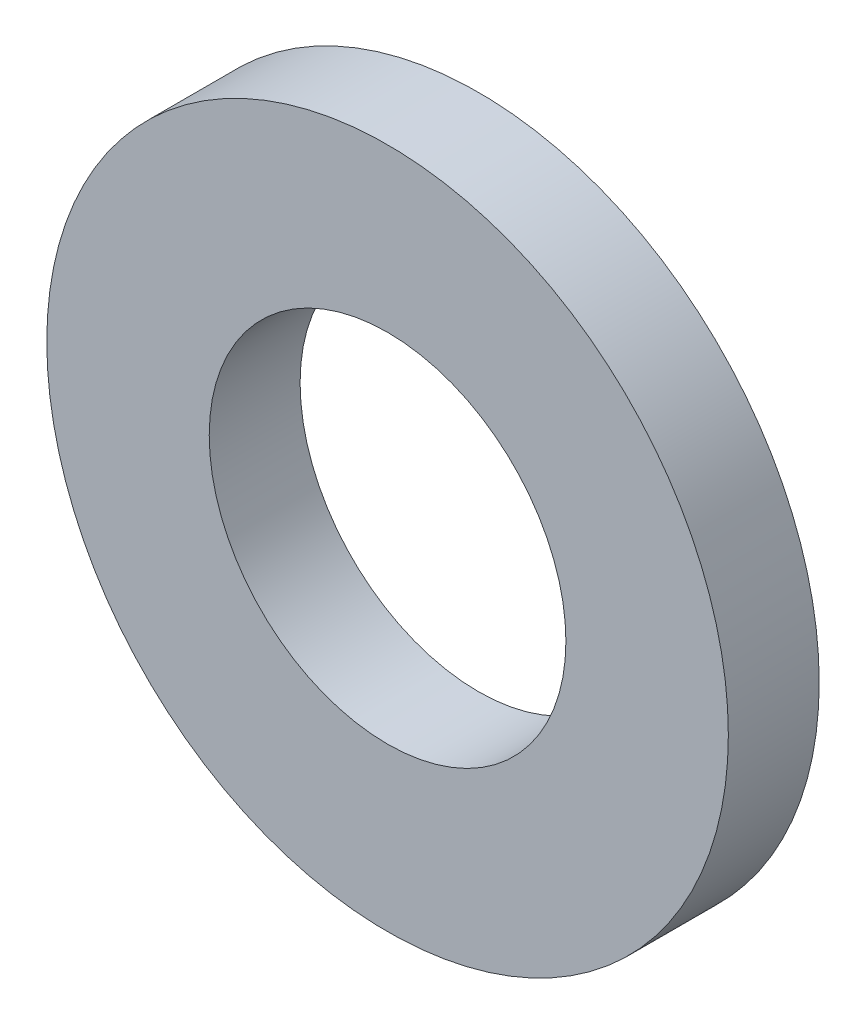
ISO-10303-21;
HEADER;
FILE_DESCRIPTION(('STEP AP214'),'2;1');
FILE_NAME('part.step','',(''),(''),'','','');
FILE_SCHEMA(('AUTOMOTIVE_DESIGN { 1 0 10303 214 1 1 1 1 }'));
ENDSEC;
DATA;
#1=APPLICATION_CONTEXT('core data for automotive mechanical design processes');
#2=APPLICATION_PROTOCOL_DEFINITION('international standard','automotive_design',2000,#1);
#3=PRODUCT_CONTEXT('',#1,'mechanical');
#4=PRODUCT('Part','Part','',(#3));
#5=PRODUCT_RELATED_PRODUCT_CATEGORY('part','',(#4));
#6=PRODUCT_DEFINITION_FORMATION('','',#4);
#7=PRODUCT_DEFINITION_CONTEXT('part definition',#1,'design');
#8=PRODUCT_DEFINITION('design','',#6,#7);
#9=PRODUCT_DEFINITION_SHAPE('','',#8);
#10=(LENGTH_UNIT() NAMED_UNIT(*) SI_UNIT(.MILLI.,.METRE.));
#11=(NAMED_UNIT(*) PLANE_ANGLE_UNIT() SI_UNIT($,.RADIAN.));
#12=(NAMED_UNIT(*) SI_UNIT($,.STERADIAN.) SOLID_ANGLE_UNIT());
#13=UNCERTAINTY_MEASURE_WITH_UNIT(LENGTH_MEASURE(1.E-05),#10,'distance_accuracy_value','');
#14=(GEOMETRIC_REPRESENTATION_CONTEXT(3) GLOBAL_UNCERTAINTY_ASSIGNED_CONTEXT((#13)) GLOBAL_UNIT_ASSIGNED_CONTEXT((#10,
#11,#12)) REPRESENTATION_CONTEXT('',''));
#15=CARTESIAN_POINT('',(0.,0.,0.));
#16=DIRECTION('',(0.,0.,1.));
#17=DIRECTION('',(1.,0.,0.));
#18=AXIS2_PLACEMENT_3D('',#15,#16,#17);
#19=CARTESIAN_POINT('',(0.,0.,-0.8));
#20=DIRECTION('',(0.,0.,1.));
#21=DIRECTION('',(1.,0.,0.));
#22=AXIS2_PLACEMENT_3D('',#19,#20,#21);
#23=CYLINDRICAL_SURFACE('',#22,3.);
#24=CARTESIAN_POINT('',(0.,0.,-0.8));
#25=DIRECTION('',(0.,0.,1.));
#26=DIRECTION('',(1.,0.,0.));
#27=AXIS2_PLACEMENT_3D('',#24,#25,#26);
#28=CIRCLE('',#27,3.);
#29=CARTESIAN_POINT('',(3.,0.,-0.8));
#30=VERTEX_POINT('',#29);
#31=EDGE_CURVE('E10',#30,#30,#28,.T.);
#32=ORIENTED_EDGE('',*,*,#31,.T.);
#33=EDGE_LOOP('',(#32));
#34=FACE_BOUND('',#33,.T.);
#35=CARTESIAN_POINT('',(0.,0.,0.));
#36=DIRECTION('',(0.,0.,1.));
#37=DIRECTION('',(1.,0.,0.));
#38=AXIS2_PLACEMENT_3D('',#35,#36,#37);
#39=CIRCLE('',#38,3.);
#40=CARTESIAN_POINT('',(3.,0.,0.));
#41=VERTEX_POINT('',#40);
#42=EDGE_CURVE('E33',#41,#41,#39,.T.);
#43=ORIENTED_EDGE('',*,*,#42,.F.);
#44=EDGE_LOOP('',(#43));
#45=FACE_BOUND('',#44,.T.);
#46=ADVANCED_FACE('F30',(#34,#45),#23,.T.);
#47=CARTESIAN_POINT('',(0.,0.,-0.8));
#48=DIRECTION('',(0.,0.,1.));
#49=DIRECTION('',(1.,0.,0.));
#50=AXIS2_PLACEMENT_3D('',#47,#48,#49);
#51=PLANE('',#50);
#52=CARTESIAN_POINT('',(0.,0.,-0.8));
#53=DIRECTION('',(0.,0.,1.));
#54=DIRECTION('',(1.,0.,0.));
#55=AXIS2_PLACEMENT_3D('',#52,#53,#54);
#56=CIRCLE('',#55,1.57);
#57=CARTESIAN_POINT('',(1.57,0.,-0.8));
#58=VERTEX_POINT('',#57);
#59=EDGE_CURVE('E40',#58,#58,#56,.T.);
#60=ORIENTED_EDGE('',*,*,#59,.T.);
#61=EDGE_LOOP('',(#60));
#62=FACE_BOUND('',#61,.T.);
#63=ORIENTED_EDGE('',*,*,#31,.F.);
#64=EDGE_LOOP('',(#63));
#65=FACE_BOUND('',#64,.T.);
#66=ADVANCED_FACE('F48',(#62,#65),#51,.F.);
#67=CARTESIAN_POINT('',(0.,0.,0.));
#68=DIRECTION('',(0.,0.,1.));
#69=DIRECTION('',(1.,0.,0.));
#70=AXIS2_PLACEMENT_3D('',#67,#68,#69);
#71=PLANE('',#70);
#72=CARTESIAN_POINT('',(0.,0.,0.));
#73=DIRECTION('',(0.,0.,1.));
#74=DIRECTION('',(1.,0.,0.));
#75=AXIS2_PLACEMENT_3D('',#72,#73,#74);
#76=CIRCLE('',#75,1.57);
#77=CARTESIAN_POINT('',(1.57,0.,0.));
#78=VERTEX_POINT('',#77);
#79=EDGE_CURVE('E42',#78,#78,#76,.T.);
#80=ORIENTED_EDGE('',*,*,#79,.F.);
#81=EDGE_LOOP('',(#80));
#82=FACE_BOUND('',#81,.T.);
#83=ORIENTED_EDGE('',*,*,#42,.T.);
#84=EDGE_LOOP('',(#83));
#85=FACE_BOUND('',#84,.T.);
#86=ADVANCED_FACE('F54',(#82,#85),#71,.T.);
#87=CARTESIAN_POINT('',(0.,0.,-0.8));
#88=DIRECTION('',(0.,0.,1.));
#89=DIRECTION('',(1.,0.,0.));
#90=AXIS2_PLACEMENT_3D('',#87,#88,#89);
#91=CYLINDRICAL_SURFACE('',#90,1.57);
#92=ORIENTED_EDGE('',*,*,#59,.F.);
#93=EDGE_LOOP('',(#92));
#94=FACE_BOUND('',#93,.T.);
#95=ORIENTED_EDGE('',*,*,#79,.T.);
#96=EDGE_LOOP('',(#95));
#97=FACE_BOUND('',#96,.T.);
#98=ADVANCED_FACE('F51',(#94,#97),#91,.F.);
#99=CLOSED_SHELL('',(#46,#66,#86,#98));
#100=MANIFOLD_SOLID_BREP('B2',#99);
#101=ADVANCED_BREP_SHAPE_REPRESENTATION('',(#18,#100),#14);
#102=SHAPE_DEFINITION_REPRESENTATION(#9,#101);
ENDSEC;
END-ISO-10303-21;
